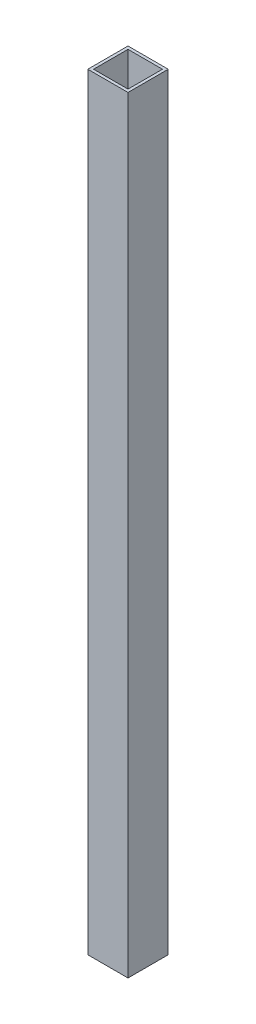
ISO-10303-21;
HEADER;
FILE_DESCRIPTION(('STEP AP214'),'2;1');
FILE_NAME('part.step','',(''),(''),'','','');
FILE_SCHEMA(('AUTOMOTIVE_DESIGN { 1 0 10303 214 1 1 1 1 }'));
ENDSEC;
DATA;
#1=APPLICATION_CONTEXT('core data for automotive mechanical design processes');
#2=APPLICATION_PROTOCOL_DEFINITION('international standard','automotive_design',2000,#1);
#3=PRODUCT_CONTEXT('',#1,'mechanical');
#4=PRODUCT('Part','Part','',(#3));
#5=PRODUCT_RELATED_PRODUCT_CATEGORY('part','',(#4));
#6=PRODUCT_DEFINITION_FORMATION('','',#4);
#7=PRODUCT_DEFINITION_CONTEXT('part definition',#1,'design');
#8=PRODUCT_DEFINITION('design','',#6,#7);
#9=PRODUCT_DEFINITION_SHAPE('','',#8);
#10=(LENGTH_UNIT() NAMED_UNIT(*) SI_UNIT(.MILLI.,.METRE.));
#11=(NAMED_UNIT(*) PLANE_ANGLE_UNIT() SI_UNIT($,.RADIAN.));
#12=(NAMED_UNIT(*) SI_UNIT($,.STERADIAN.) SOLID_ANGLE_UNIT());
#13=UNCERTAINTY_MEASURE_WITH_UNIT(LENGTH_MEASURE(1.E-05),#10,'distance_accuracy_value','');
#14=(GEOMETRIC_REPRESENTATION_CONTEXT(3) GLOBAL_UNCERTAINTY_ASSIGNED_CONTEXT((#13)) GLOBAL_UNIT_ASSIGNED_CONTEXT((#10,
#11,#12)) REPRESENTATION_CONTEXT('',''));
#15=CARTESIAN_POINT('',(0.,0.,0.));
#16=DIRECTION('',(0.,0.,1.));
#17=DIRECTION('',(1.,0.,0.));
#18=AXIS2_PLACEMENT_3D('',#15,#16,#17);
#19=CARTESIAN_POINT('',(44.45,0.,-44.45));
#20=DIRECTION('',(0.,0.,-1.));
#21=DIRECTION('',(-1.,0.,0.));
#22=AXIS2_PLACEMENT_3D('',#19,#20,#21);
#23=PLANE('',#22);
#24=DIRECTION('',(0.,1.,0.));
#25=VECTOR('',#24,1.);
#26=CARTESIAN_POINT('',(44.45,0.,-44.45));
#27=LINE('',#26,#25);
#28=CARTESIAN_POINT('',(44.45,0.,-44.45));
#29=VERTEX_POINT('',#28);
#30=CARTESIAN_POINT('',(44.45,847.725,-44.45));
#31=VERTEX_POINT('',#30);
#32=EDGE_CURVE('E113',#29,#31,#27,.T.);
#33=ORIENTED_EDGE('',*,*,#32,.F.);
#34=DIRECTION('',(1.,0.,0.));
#35=VECTOR('',#34,1.);
#36=CARTESIAN_POINT('',(0.,0.,-44.45));
#37=LINE('',#36,#35);
#38=CARTESIAN_POINT('',(0.,0.,-44.45));
#39=VERTEX_POINT('',#38);
#40=EDGE_CURVE('E135',#29,#39,#37,.F.);
#41=ORIENTED_EDGE('',*,*,#40,.T.);
#42=DIRECTION('',(0.,1.,0.));
#43=VECTOR('',#42,1.);
#44=CARTESIAN_POINT('',(0.,0.,-44.45));
#45=LINE('',#44,#43);
#46=CARTESIAN_POINT('',(0.,847.725,-44.45));
#47=VERTEX_POINT('',#46);
#48=EDGE_CURVE('E130',#47,#39,#45,.F.);
#49=ORIENTED_EDGE('',*,*,#48,.F.);
#50=DIRECTION('',(1.,0.,0.));
#51=VECTOR('',#50,1.);
#52=CARTESIAN_POINT('',(0.,847.725,-44.45));
#53=LINE('',#52,#51);
#54=EDGE_CURVE('E105',#31,#47,#53,.F.);
#55=ORIENTED_EDGE('',*,*,#54,.F.);
#56=EDGE_LOOP('',(#33,#41,#49,#55));
#57=FACE_BOUND('',#56,.T.);
#58=ADVANCED_FACE('F16',(#57),#23,.T.);
#59=CARTESIAN_POINT('',(41.275,0.,-41.275));
#60=DIRECTION('',(-1.,0.,0.));
#61=DIRECTION('',(0.,0.,1.));
#62=AXIS2_PLACEMENT_3D('',#59,#60,#61);
#63=PLANE('',#62);
#64=DIRECTION('',(0.,1.,0.));
#65=VECTOR('',#64,1.);
#66=CARTESIAN_POINT('',(41.275,0.,-41.275));
#67=LINE('',#66,#65);
#68=CARTESIAN_POINT('',(41.275,0.,-41.275));
#69=VERTEX_POINT('',#68);
#70=CARTESIAN_POINT('',(41.275,847.725,-41.275));
#71=VERTEX_POINT('',#70);
#72=EDGE_CURVE('E90',#69,#71,#67,.T.);
#73=ORIENTED_EDGE('',*,*,#72,.F.);
#74=DIRECTION('',(0.,0.,1.));
#75=VECTOR('',#74,1.);
#76=CARTESIAN_POINT('',(41.275,0.,0.));
#77=LINE('',#76,#75);
#78=CARTESIAN_POINT('',(41.275,0.,-3.175));
#79=VERTEX_POINT('',#78);
#80=EDGE_CURVE('E138',#69,#79,#77,.T.);
#81=ORIENTED_EDGE('',*,*,#80,.T.);
#82=DIRECTION('',(0.,1.,0.));
#83=VECTOR('',#82,1.);
#84=CARTESIAN_POINT('',(41.275,0.,-3.175));
#85=LINE('',#84,#83);
#86=CARTESIAN_POINT('',(41.275,847.725,-3.175));
#87=VERTEX_POINT('',#86);
#88=EDGE_CURVE('E19',#87,#79,#85,.F.);
#89=ORIENTED_EDGE('',*,*,#88,.F.);
#90=DIRECTION('',(0.,0.,1.));
#91=VECTOR('',#90,1.);
#92=CARTESIAN_POINT('',(41.275,847.725,0.));
#93=LINE('',#92,#91);
#94=EDGE_CURVE('E104',#71,#87,#93,.T.);
#95=ORIENTED_EDGE('',*,*,#94,.F.);
#96=EDGE_LOOP('',(#73,#81,#89,#95));
#97=FACE_BOUND('',#96,.T.);
#98=ADVANCED_FACE('F124',(#97),#63,.T.);
#99=CARTESIAN_POINT('',(41.275,0.,-3.175));
#100=DIRECTION('',(0.,0.,-1.));
#101=DIRECTION('',(-1.,0.,0.));
#102=AXIS2_PLACEMENT_3D('',#99,#100,#101);
#103=PLANE('',#102);
#104=ORIENTED_EDGE('',*,*,#88,.T.);
#105=DIRECTION('',(1.,0.,0.));
#106=VECTOR('',#105,1.);
#107=CARTESIAN_POINT('',(0.,0.,-3.175));
#108=LINE('',#107,#106);
#109=CARTESIAN_POINT('',(3.175,0.,-3.175));
#110=VERTEX_POINT('',#109);
#111=EDGE_CURVE('E87',#79,#110,#108,.F.);
#112=ORIENTED_EDGE('',*,*,#111,.T.);
#113=DIRECTION('',(0.,1.,0.));
#114=VECTOR('',#113,1.);
#115=CARTESIAN_POINT('',(3.175,0.,-3.175));
#116=LINE('',#115,#114);
#117=CARTESIAN_POINT('',(3.175,847.725,-3.175));
#118=VERTEX_POINT('',#117);
#119=EDGE_CURVE('E79',#118,#110,#116,.F.);
#120=ORIENTED_EDGE('',*,*,#119,.F.);
#121=DIRECTION('',(1.,0.,0.));
#122=VECTOR('',#121,1.);
#123=CARTESIAN_POINT('',(0.,847.725,-3.175));
#124=LINE('',#123,#122);
#125=EDGE_CURVE('E84',#87,#118,#124,.F.);
#126=ORIENTED_EDGE('',*,*,#125,.F.);
#127=EDGE_LOOP('',(#104,#112,#120,#126));
#128=FACE_BOUND('',#127,.T.);
#129=ADVANCED_FACE('F82',(#128),#103,.T.);
#130=CARTESIAN_POINT('',(3.175,0.,-3.175));
#131=DIRECTION('',(1.,0.,0.));
#132=DIRECTION('',(0.,0.,-1.));
#133=AXIS2_PLACEMENT_3D('',#130,#131,#132);
#134=PLANE('',#133);
#135=ORIENTED_EDGE('',*,*,#119,.T.);
#136=DIRECTION('',(0.,0.,1.));
#137=VECTOR('',#136,1.);
#138=CARTESIAN_POINT('',(3.175,0.,0.));
#139=LINE('',#138,#137);
#140=CARTESIAN_POINT('',(3.175,0.,-41.275));
#141=VERTEX_POINT('',#140);
#142=EDGE_CURVE('E141',#110,#141,#139,.F.);
#143=ORIENTED_EDGE('',*,*,#142,.T.);
#144=DIRECTION('',(0.,1.,0.));
#145=VECTOR('',#144,1.);
#146=CARTESIAN_POINT('',(3.175,0.,-41.275));
#147=LINE('',#146,#145);
#148=CARTESIAN_POINT('',(3.175,847.725,-41.275));
#149=VERTEX_POINT('',#148);
#150=EDGE_CURVE('E95',#149,#141,#147,.F.);
#151=ORIENTED_EDGE('',*,*,#150,.F.);
#152=DIRECTION('',(0.,0.,1.));
#153=VECTOR('',#152,1.);
#154=CARTESIAN_POINT('',(3.175,847.725,0.));
#155=LINE('',#154,#153);
#156=EDGE_CURVE('E92',#118,#149,#155,.F.);
#157=ORIENTED_EDGE('',*,*,#156,.F.);
#158=EDGE_LOOP('',(#135,#143,#151,#157));
#159=FACE_BOUND('',#158,.T.);
#160=ADVANCED_FACE('F93',(#159),#134,.T.);
#161=CARTESIAN_POINT('',(3.175,0.,-41.275));
#162=DIRECTION('',(0.,0.,1.));
#163=DIRECTION('',(1.,0.,0.));
#164=AXIS2_PLACEMENT_3D('',#161,#162,#163);
#165=PLANE('',#164);
#166=ORIENTED_EDGE('',*,*,#150,.T.);
#167=DIRECTION('',(1.,0.,0.));
#168=VECTOR('',#167,1.);
#169=CARTESIAN_POINT('',(0.,0.,-41.275));
#170=LINE('',#169,#168);
#171=EDGE_CURVE('E121',#141,#69,#170,.T.);
#172=ORIENTED_EDGE('',*,*,#171,.T.);
#173=ORIENTED_EDGE('',*,*,#72,.T.);
#174=DIRECTION('',(1.,0.,0.));
#175=VECTOR('',#174,1.);
#176=CARTESIAN_POINT('',(0.,847.725,-41.275));
#177=LINE('',#176,#175);
#178=EDGE_CURVE('E99',#149,#71,#177,.T.);
#179=ORIENTED_EDGE('',*,*,#178,.F.);
#180=EDGE_LOOP('',(#166,#172,#173,#179));
#181=FACE_BOUND('',#180,.T.);
#182=ADVANCED_FACE('F119',(#181),#165,.T.);
#183=CARTESIAN_POINT('',(44.45,0.,0.));
#184=DIRECTION('',(1.,0.,0.));
#185=DIRECTION('',(0.,0.,-1.));
#186=AXIS2_PLACEMENT_3D('',#183,#184,#185);
#187=PLANE('',#186);
#188=DIRECTION('',(0.,1.,0.));
#189=VECTOR('',#188,1.);
#190=CARTESIAN_POINT('',(44.45,0.,0.));
#191=LINE('',#190,#189);
#192=CARTESIAN_POINT('',(44.45,0.,0.));
#193=VERTEX_POINT('',#192);
#194=CARTESIAN_POINT('',(44.45,847.725,0.));
#195=VERTEX_POINT('',#194);
#196=EDGE_CURVE('E144',#193,#195,#191,.T.);
#197=ORIENTED_EDGE('',*,*,#196,.F.);
#198=DIRECTION('',(0.,0.,1.));
#199=VECTOR('',#198,1.);
#200=CARTESIAN_POINT('',(44.45,0.,0.));
#201=LINE('',#200,#199);
#202=EDGE_CURVE('E132',#193,#29,#201,.F.);
#203=ORIENTED_EDGE('',*,*,#202,.T.);
#204=ORIENTED_EDGE('',*,*,#32,.T.);
#205=DIRECTION('',(0.,0.,1.));
#206=VECTOR('',#205,1.);
#207=CARTESIAN_POINT('',(44.45,847.725,0.));
#208=LINE('',#207,#206);
#209=EDGE_CURVE('E107',#195,#31,#208,.F.);
#210=ORIENTED_EDGE('',*,*,#209,.F.);
#211=EDGE_LOOP('',(#197,#203,#204,#210));
#212=FACE_BOUND('',#211,.T.);
#213=ADVANCED_FACE('F163',(#212),#187,.T.);
#214=CARTESIAN_POINT('',(0.,847.725,0.));
#215=DIRECTION('',(0.,1.,0.));
#216=DIRECTION('',(0.,0.,1.));
#217=AXIS2_PLACEMENT_3D('',#214,#215,#216);
#218=PLANE('',#217);
#219=ORIENTED_EDGE('',*,*,#178,.T.);
#220=ORIENTED_EDGE('',*,*,#94,.T.);
#221=ORIENTED_EDGE('',*,*,#125,.T.);
#222=ORIENTED_EDGE('',*,*,#156,.T.);
#223=EDGE_LOOP('',(#219,#220,#221,#222));
#224=FACE_BOUND('',#223,.T.);
#225=DIRECTION('',(0.,0.,1.));
#226=VECTOR('',#225,1.);
#227=CARTESIAN_POINT('',(0.,847.725,-44.45));
#228=LINE('',#227,#226);
#229=CARTESIAN_POINT('',(0.,847.725,0.));
#230=VERTEX_POINT('',#229);
#231=EDGE_CURVE('E125',#230,#47,#228,.F.);
#232=ORIENTED_EDGE('',*,*,#231,.F.);
#233=DIRECTION('',(1.,0.,0.));
#234=VECTOR('',#233,1.);
#235=CARTESIAN_POINT('',(0.,847.725,0.));
#236=LINE('',#235,#234);
#237=EDGE_CURVE('E147',#195,#230,#236,.F.);
#238=ORIENTED_EDGE('',*,*,#237,.F.);
#239=ORIENTED_EDGE('',*,*,#209,.T.);
#240=ORIENTED_EDGE('',*,*,#54,.T.);
#241=EDGE_LOOP('',(#232,#238,#239,#240));
#242=FACE_BOUND('',#241,.T.);
#243=ADVANCED_FACE('F101',(#224,#242),#218,.T.);
#244=CARTESIAN_POINT('',(0.,0.,-44.45));
#245=DIRECTION('',(-1.,0.,0.));
#246=DIRECTION('',(0.,0.,1.));
#247=AXIS2_PLACEMENT_3D('',#244,#245,#246);
#248=PLANE('',#247);
#249=ORIENTED_EDGE('',*,*,#48,.T.);
#250=DIRECTION('',(0.,0.,1.));
#251=VECTOR('',#250,1.);
#252=CARTESIAN_POINT('',(0.,0.,0.));
#253=LINE('',#252,#251);
#254=CARTESIAN_POINT('',(0.,0.,0.));
#255=VERTEX_POINT('',#254);
#256=EDGE_CURVE('E34',#39,#255,#253,.T.);
#257=ORIENTED_EDGE('',*,*,#256,.T.);
#258=DIRECTION('',(0.,1.,0.));
#259=VECTOR('',#258,1.);
#260=CARTESIAN_POINT('',(0.,0.,0.));
#261=LINE('',#260,#259);
#262=EDGE_CURVE('E25',#230,#255,#261,.F.);
#263=ORIENTED_EDGE('',*,*,#262,.F.);
#264=ORIENTED_EDGE('',*,*,#231,.T.);
#265=EDGE_LOOP('',(#249,#257,#263,#264));
#266=FACE_BOUND('',#265,.T.);
#267=ADVANCED_FACE('F154',(#266),#248,.T.);
#268=CARTESIAN_POINT('',(0.,0.,0.));
#269=DIRECTION('',(0.,1.,0.));
#270=DIRECTION('',(0.,0.,1.));
#271=AXIS2_PLACEMENT_3D('',#268,#269,#270);
#272=PLANE('',#271);
#273=ORIENTED_EDGE('',*,*,#142,.F.);
#274=ORIENTED_EDGE('',*,*,#111,.F.);
#275=ORIENTED_EDGE('',*,*,#80,.F.);
#276=ORIENTED_EDGE('',*,*,#171,.F.);
#277=EDGE_LOOP('',(#273,#274,#275,#276));
#278=FACE_BOUND('',#277,.T.);
#279=ORIENTED_EDGE('',*,*,#40,.F.);
#280=ORIENTED_EDGE('',*,*,#202,.F.);
#281=DIRECTION('',(1.,0.,0.));
#282=VECTOR('',#281,1.);
#283=CARTESIAN_POINT('',(0.,0.,0.));
#284=LINE('',#283,#282);
#285=EDGE_CURVE('E11',#255,#193,#284,.T.);
#286=ORIENTED_EDGE('',*,*,#285,.F.);
#287=ORIENTED_EDGE('',*,*,#256,.F.);
#288=EDGE_LOOP('',(#279,#280,#286,#287));
#289=FACE_BOUND('',#288,.T.);
#290=ADVANCED_FACE('F161',(#278,#289),#272,.F.);
#291=CARTESIAN_POINT('',(0.,0.,0.));
#292=DIRECTION('',(0.,0.,1.));
#293=DIRECTION('',(1.,0.,0.));
#294=AXIS2_PLACEMENT_3D('',#291,#292,#293);
#295=PLANE('',#294);
#296=ORIENTED_EDGE('',*,*,#262,.T.);
#297=ORIENTED_EDGE('',*,*,#285,.T.);
#298=ORIENTED_EDGE('',*,*,#196,.T.);
#299=ORIENTED_EDGE('',*,*,#237,.T.);
#300=EDGE_LOOP('',(#296,#297,#298,#299));
#301=FACE_BOUND('',#300,.T.);
#302=ADVANCED_FACE('F152',(#301),#295,.T.);
#303=CLOSED_SHELL('',(#58,#98,#129,#160,#182,#213,#243,#267,#290,#302));
#304=MANIFOLD_SOLID_BREP('B1',#303);
#305=ADVANCED_BREP_SHAPE_REPRESENTATION('',(#18,#304),#14);
#306=SHAPE_DEFINITION_REPRESENTATION(#9,#305);
ENDSEC;
END-ISO-10303-21;
